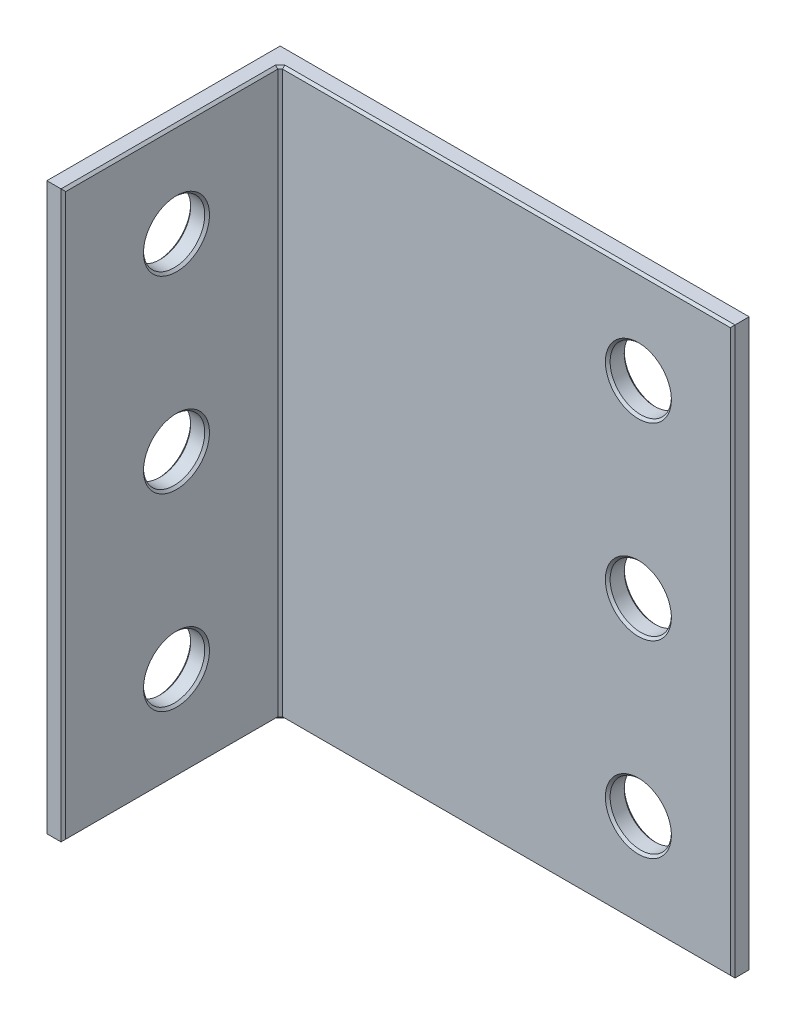
ISO-10303-21;
HEADER;
FILE_DESCRIPTION(('STEP AP214'),'2;1');
FILE_NAME('part.step','',(''),(''),'','','');
FILE_SCHEMA(('AUTOMOTIVE_DESIGN { 1 0 10303 214 1 1 1 1 }'));
ENDSEC;
DATA;
#1=APPLICATION_CONTEXT('core data for automotive mechanical design processes');
#2=APPLICATION_PROTOCOL_DEFINITION('international standard','automotive_design',2000,#1);
#3=PRODUCT_CONTEXT('',#1,'mechanical');
#4=PRODUCT('Part','Part','',(#3));
#5=PRODUCT_RELATED_PRODUCT_CATEGORY('part','',(#4));
#6=PRODUCT_DEFINITION_FORMATION('','',#4);
#7=PRODUCT_DEFINITION_CONTEXT('part definition',#1,'design');
#8=PRODUCT_DEFINITION('design','',#6,#7);
#9=PRODUCT_DEFINITION_SHAPE('','',#8);
#10=(LENGTH_UNIT() NAMED_UNIT(*) SI_UNIT(.MILLI.,.METRE.));
#11=(NAMED_UNIT(*) PLANE_ANGLE_UNIT() SI_UNIT($,.RADIAN.));
#12=(NAMED_UNIT(*) SI_UNIT($,.STERADIAN.) SOLID_ANGLE_UNIT());
#13=UNCERTAINTY_MEASURE_WITH_UNIT(LENGTH_MEASURE(1.E-05),#10,'distance_accuracy_value','');
#14=(GEOMETRIC_REPRESENTATION_CONTEXT(3) GLOBAL_UNCERTAINTY_ASSIGNED_CONTEXT((#13)) GLOBAL_UNIT_ASSIGNED_CONTEXT((#10,
#11,#12)) REPRESENTATION_CONTEXT('',''));
#15=CARTESIAN_POINT('',(0.,0.,0.));
#16=DIRECTION('',(0.,0.,1.));
#17=DIRECTION('',(1.,0.,0.));
#18=AXIS2_PLACEMENT_3D('',#15,#16,#17);
#19=CARTESIAN_POINT('',(0.,0.,8.));
#20=DIRECTION('',(0.,1.,0.));
#21=DIRECTION('',(0.,0.,1.));
#22=AXIS2_PLACEMENT_3D('',#19,#20,#21);
#23=PLANE('',#22);
#24=DIRECTION('',(0.,0.,-1.));
#25=VECTOR('',#24,1.);
#26=CARTESIAN_POINT('',(1.,0.,8.));
#27=LINE('',#26,#25);
#28=CARTESIAN_POINT('',(1.,0.,100.));
#29=VERTEX_POINT('',#28);
#30=CARTESIAN_POINT('',(1.,0.,1.));
#31=VERTEX_POINT('',#30);
#32=EDGE_CURVE('E340',#29,#31,#27,.T.);
#33=ORIENTED_EDGE('',*,*,#32,.T.);
#34=DIRECTION('',(1.,0.,0.));
#35=VECTOR('',#34,1.);
#36=CARTESIAN_POINT('',(200.,0.,1.));
#37=LINE('',#36,#35);
#38=CARTESIAN_POINT('',(200.,0.,1.));
#39=VERTEX_POINT('',#38);
#40=EDGE_CURVE('E342',#31,#39,#37,.T.);
#41=ORIENTED_EDGE('',*,*,#40,.T.);
#42=DIRECTION('',(0.,0.,-1.));
#43=VECTOR('',#42,1.);
#44=CARTESIAN_POINT('',(200.,0.,8.));
#45=LINE('',#44,#43);
#46=CARTESIAN_POINT('',(200.,0.,6.99999999999999));
#47=VERTEX_POINT('',#46);
#48=EDGE_CURVE('E354',#47,#39,#45,.T.);
#49=ORIENTED_EDGE('',*,*,#48,.F.);
#50=DIRECTION('',(-1.,0.,0.));
#51=VECTOR('',#50,1.);
#52=CARTESIAN_POINT('',(0.,0.,6.99999999999999));
#53=LINE('',#52,#51);
#54=CARTESIAN_POINT('',(9.00000000000002,0.,6.99999999999999));
#55=VERTEX_POINT('',#54);
#56=EDGE_CURVE('E336',#47,#55,#53,.T.);
#57=ORIENTED_EDGE('',*,*,#56,.T.);
#58=DIRECTION('',(0.707106781186544,0.,-0.707106781186551));
#59=VECTOR('',#58,1.);
#60=CARTESIAN_POINT('',(9.00000000000002,0.,6.99999999999999));
#61=LINE('',#60,#59);
#62=CARTESIAN_POINT('',(8.00000000000001,0.,8.));
#63=VERTEX_POINT('',#62);
#64=EDGE_CURVE('E332',#63,#55,#61,.T.);
#65=ORIENTED_EDGE('',*,*,#64,.F.);
#66=DIRECTION('',(0.707106781186544,0.,-0.707106781186551));
#67=VECTOR('',#66,1.);
#68=CARTESIAN_POINT('',(9.00000000000002,0.,6.99999999999999));
#69=LINE('',#68,#67);
#70=CARTESIAN_POINT('',(7.00000000000003,0.,9.00000000000001));
#71=VERTEX_POINT('',#70);
#72=EDGE_CURVE('E289',#71,#63,#69,.T.);
#73=ORIENTED_EDGE('',*,*,#72,.F.);
#74=DIRECTION('',(0.,0.,1.));
#75=VECTOR('',#74,1.);
#76=CARTESIAN_POINT('',(7.00000000000003,0.,8.));
#77=LINE('',#76,#75);
#78=CARTESIAN_POINT('',(7.00000000000003,0.,100.));
#79=VERTEX_POINT('',#78);
#80=EDGE_CURVE('E294',#71,#79,#77,.T.);
#81=ORIENTED_EDGE('',*,*,#80,.T.);
#82=DIRECTION('',(1.,0.,0.));
#83=VECTOR('',#82,1.);
#84=CARTESIAN_POINT('',(0.,0.,100.));
#85=LINE('',#84,#83);
#86=EDGE_CURVE('E258',#29,#79,#85,.T.);
#87=ORIENTED_EDGE('',*,*,#86,.F.);
#88=EDGE_LOOP('',(#33,#41,#49,#57,#65,#73,#81,#87));
#89=FACE_BOUND('',#88,.T.);
#90=ADVANCED_FACE('F34',(#89),#23,.F.);
#91=CARTESIAN_POINT('',(0.,240.,8.));
#92=DIRECTION('',(0.,0.,-1.));
#93=DIRECTION('',(-1.,0.,0.));
#94=AXIS2_PLACEMENT_3D('',#91,#92,#93);
#95=PLANE('',#94);
#96=CARTESIAN_POINT('',(160.,120.,8.));
#97=DIRECTION('',(0.,0.,-1.));
#98=DIRECTION('',(-1.,0.,0.));
#99=AXIS2_PLACEMENT_3D('',#96,#97,#98);
#100=CIRCLE('',#99,14.);
#101=CARTESIAN_POINT('',(146.,120.,8.));
#102=VERTEX_POINT('',#101);
#103=EDGE_CURVE('E327',#102,#102,#100,.T.);
#104=ORIENTED_EDGE('',*,*,#103,.T.);
#105=EDGE_LOOP('',(#104));
#106=FACE_BOUND('',#105,.T.);
#107=CARTESIAN_POINT('',(160.,40.,8.));
#108=DIRECTION('',(0.,0.,-1.));
#109=DIRECTION('',(-1.,0.,0.));
#110=AXIS2_PLACEMENT_3D('',#107,#108,#109);
#111=CIRCLE('',#110,14.);
#112=CARTESIAN_POINT('',(146.,40.,8.));
#113=VERTEX_POINT('',#112);
#114=EDGE_CURVE('E320',#113,#113,#111,.T.);
#115=ORIENTED_EDGE('',*,*,#114,.T.);
#116=EDGE_LOOP('',(#115));
#117=FACE_BOUND('',#116,.T.);
#118=CARTESIAN_POINT('',(160.,200.,8.));
#119=DIRECTION('',(0.,0.,-1.));
#120=DIRECTION('',(-1.,0.,0.));
#121=AXIS2_PLACEMENT_3D('',#118,#119,#120);
#122=CIRCLE('',#121,14.);
#123=CARTESIAN_POINT('',(146.,200.,8.));
#124=VERTEX_POINT('',#123);
#125=EDGE_CURVE('E317',#124,#124,#122,.T.);
#126=ORIENTED_EDGE('',*,*,#125,.T.);
#127=EDGE_LOOP('',(#126));
#128=FACE_BOUND('',#127,.T.);
#129=DIRECTION('',(0.,1.,0.));
#130=VECTOR('',#129,1.);
#131=CARTESIAN_POINT('',(199.,240.,8.));
#132=LINE('',#131,#130);
#133=CARTESIAN_POINT('',(199.,1.,8.));
#134=VERTEX_POINT('',#133);
#135=CARTESIAN_POINT('',(199.,239.,8.));
#136=VERTEX_POINT('',#135);
#137=EDGE_CURVE('E314',#134,#136,#132,.T.);
#138=ORIENTED_EDGE('',*,*,#137,.T.);
#139=DIRECTION('',(-1.,0.,0.));
#140=VECTOR('',#139,1.);
#141=CARTESIAN_POINT('',(0.,239.,8.));
#142=LINE('',#141,#140);
#143=CARTESIAN_POINT('',(9.,239.,8.));
#144=VERTEX_POINT('',#143);
#145=EDGE_CURVE('E311',#136,#144,#142,.T.);
#146=ORIENTED_EDGE('',*,*,#145,.T.);
#147=DIRECTION('',(0.,-1.,0.));
#148=VECTOR('',#147,1.);
#149=CARTESIAN_POINT('',(9.00000000000002,0.,8.));
#150=LINE('',#149,#148);
#151=CARTESIAN_POINT('',(9.00000000000002,1.,8.));
#152=VERTEX_POINT('',#151);
#153=EDGE_CURVE('E304',#144,#152,#150,.T.);
#154=ORIENTED_EDGE('',*,*,#153,.T.);
#155=DIRECTION('',(1.,0.,0.));
#156=VECTOR('',#155,1.);
#157=CARTESIAN_POINT('',(0.,1.,8.));
#158=LINE('',#157,#156);
#159=EDGE_CURVE('E307',#152,#134,#158,.T.);
#160=ORIENTED_EDGE('',*,*,#159,.T.);
#161=EDGE_LOOP('',(#138,#146,#154,#160));
#162=FACE_BOUND('',#161,.T.);
#163=ADVANCED_FACE('F312',(#106,#117,#128,#162),#95,.F.);
#164=CARTESIAN_POINT('',(0.,240.,0.));
#165=DIRECTION('',(0.,0.,-1.));
#166=DIRECTION('',(-1.,0.,0.));
#167=AXIS2_PLACEMENT_3D('',#164,#165,#166);
#168=PLANE('',#167);
#169=CARTESIAN_POINT('',(160.,200.,0.));
#170=DIRECTION('',(0.,0.,-1.));
#171=DIRECTION('',(-1.,0.,0.));
#172=AXIS2_PLACEMENT_3D('',#169,#170,#171);
#173=CIRCLE('',#172,14.);
#174=CARTESIAN_POINT('',(146.,200.,0.));
#175=VERTEX_POINT('',#174);
#176=EDGE_CURVE('E386',#175,#175,#173,.F.);
#177=ORIENTED_EDGE('',*,*,#176,.T.);
#178=EDGE_LOOP('',(#177));
#179=FACE_BOUND('',#178,.T.);
#180=CARTESIAN_POINT('',(160.,40.,0.));
#181=DIRECTION('',(0.,0.,-1.));
#182=DIRECTION('',(-1.,0.,0.));
#183=AXIS2_PLACEMENT_3D('',#180,#181,#182);
#184=CIRCLE('',#183,14.);
#185=CARTESIAN_POINT('',(146.,40.,0.));
#186=VERTEX_POINT('',#185);
#187=EDGE_CURVE('E383',#186,#186,#184,.F.);
#188=ORIENTED_EDGE('',*,*,#187,.T.);
#189=EDGE_LOOP('',(#188));
#190=FACE_BOUND('',#189,.T.);
#191=CARTESIAN_POINT('',(160.,120.,0.));
#192=DIRECTION('',(0.,0.,-1.));
#193=DIRECTION('',(-1.,0.,0.));
#194=AXIS2_PLACEMENT_3D('',#191,#192,#193);
#195=CIRCLE('',#194,14.);
#196=CARTESIAN_POINT('',(146.,120.,0.));
#197=VERTEX_POINT('',#196);
#198=EDGE_CURVE('E375',#197,#197,#195,.F.);
#199=ORIENTED_EDGE('',*,*,#198,.T.);
#200=EDGE_LOOP('',(#199));
#201=FACE_BOUND('',#200,.T.);
#202=DIRECTION('',(0.,-1.,0.));
#203=VECTOR('',#202,1.);
#204=CARTESIAN_POINT('',(199.,0.,0.));
#205=LINE('',#204,#203);
#206=CARTESIAN_POINT('',(199.,239.,0.));
#207=VERTEX_POINT('',#206);
#208=CARTESIAN_POINT('',(199.,1.,0.));
#209=VERTEX_POINT('',#208);
#210=EDGE_CURVE('E368',#207,#209,#205,.T.);
#211=ORIENTED_EDGE('',*,*,#210,.T.);
#212=DIRECTION('',(-1.,0.,0.));
#213=VECTOR('',#212,1.);
#214=CARTESIAN_POINT('',(0.,1.,0.));
#215=LINE('',#214,#213);
#216=CARTESIAN_POINT('',(1.,1.,0.));
#217=VERTEX_POINT('',#216);
#218=EDGE_CURVE('E372',#209,#217,#215,.T.);
#219=ORIENTED_EDGE('',*,*,#218,.T.);
#220=DIRECTION('',(0.,1.,0.));
#221=VECTOR('',#220,1.);
#222=CARTESIAN_POINT('',(1.,240.,0.));
#223=LINE('',#222,#221);
#224=CARTESIAN_POINT('',(1.,239.,0.));
#225=VERTEX_POINT('',#224);
#226=EDGE_CURVE('E377',#217,#225,#223,.T.);
#227=ORIENTED_EDGE('',*,*,#226,.T.);
#228=DIRECTION('',(1.,0.,0.));
#229=VECTOR('',#228,1.);
#230=CARTESIAN_POINT('',(200.,239.,0.));
#231=LINE('',#230,#229);
#232=EDGE_CURVE('E373',#225,#207,#231,.T.);
#233=ORIENTED_EDGE('',*,*,#232,.T.);
#234=EDGE_LOOP('',(#211,#219,#227,#233));
#235=FACE_BOUND('',#234,.T.);
#236=ADVANCED_FACE('F432',(#179,#190,#201,#235),#168,.T.);
#237=CARTESIAN_POINT('',(0.,0.,8.));
#238=DIRECTION('',(1.,0.,0.));
#239=DIRECTION('',(0.,0.,-1.));
#240=AXIS2_PLACEMENT_3D('',#237,#238,#239);
#241=PLANE('',#240);
#242=DIRECTION('',(0.,1.,0.));
#243=VECTOR('',#242,1.);
#244=CARTESIAN_POINT('',(0.,240.,99.));
#245=LINE('',#244,#243);
#246=CARTESIAN_POINT('',(0.,1.,99.));
#247=VERTEX_POINT('',#246);
#248=CARTESIAN_POINT('',(0.,239.,99.));
#249=VERTEX_POINT('',#248);
#250=EDGE_CURVE('E190',#247,#249,#245,.T.);
#251=ORIENTED_EDGE('',*,*,#250,.T.);
#252=DIRECTION('',(0.,0.,-1.));
#253=VECTOR('',#252,1.);
#254=CARTESIAN_POINT('',(0.,239.,8.));
#255=LINE('',#254,#253);
#256=CARTESIAN_POINT('',(0.,239.,1.));
#257=VERTEX_POINT('',#256);
#258=EDGE_CURVE('E192',#249,#257,#255,.T.);
#259=ORIENTED_EDGE('',*,*,#258,.T.);
#260=DIRECTION('',(0.,-1.,0.));
#261=VECTOR('',#260,1.);
#262=CARTESIAN_POINT('',(0.,0.,1.));
#263=LINE('',#262,#261);
#264=CARTESIAN_POINT('',(0.,1.,1.));
#265=VERTEX_POINT('',#264);
#266=EDGE_CURVE('E186',#257,#265,#263,.T.);
#267=ORIENTED_EDGE('',*,*,#266,.T.);
#268=DIRECTION('',(0.,0.,1.));
#269=VECTOR('',#268,1.);
#270=CARTESIAN_POINT('',(0.,1.,8.));
#271=LINE('',#270,#269);
#272=EDGE_CURVE('E188',#265,#247,#271,.T.);
#273=ORIENTED_EDGE('',*,*,#272,.T.);
#274=EDGE_LOOP('',(#251,#259,#267,#273));
#275=FACE_BOUND('',#274,.T.);
#276=CARTESIAN_POINT('',(0.,200.,52.));
#277=DIRECTION('',(1.,0.,0.));
#278=DIRECTION('',(0.,0.,-1.));
#279=AXIS2_PLACEMENT_3D('',#276,#277,#278);
#280=CIRCLE('',#279,14.);
#281=CARTESIAN_POINT('',(0.,200.,38.));
#282=VERTEX_POINT('',#281);
#283=EDGE_CURVE('E183',#282,#282,#280,.T.);
#284=ORIENTED_EDGE('',*,*,#283,.T.);
#285=EDGE_LOOP('',(#284));
#286=FACE_BOUND('',#285,.T.);
#287=CARTESIAN_POINT('',(0.,120.,52.));
#288=DIRECTION('',(1.,0.,0.));
#289=DIRECTION('',(0.,0.,-1.));
#290=AXIS2_PLACEMENT_3D('',#287,#288,#289);
#291=CIRCLE('',#290,14.);
#292=CARTESIAN_POINT('',(0.,120.,38.));
#293=VERTEX_POINT('',#292);
#294=EDGE_CURVE('E180',#293,#293,#291,.T.);
#295=ORIENTED_EDGE('',*,*,#294,.T.);
#296=EDGE_LOOP('',(#295));
#297=FACE_BOUND('',#296,.T.);
#298=CARTESIAN_POINT('',(0.,40.,52.));
#299=DIRECTION('',(1.,0.,0.));
#300=DIRECTION('',(0.,0.,-1.));
#301=AXIS2_PLACEMENT_3D('',#298,#299,#300);
#302=CIRCLE('',#301,14.);
#303=CARTESIAN_POINT('',(0.,40.,38.));
#304=VERTEX_POINT('',#303);
#305=EDGE_CURVE('E177',#304,#304,#302,.T.);
#306=ORIENTED_EDGE('',*,*,#305,.T.);
#307=EDGE_LOOP('',(#306));
#308=FACE_BOUND('',#307,.T.);
#309=ADVANCED_FACE('F438',(#275,#286,#297,#308),#241,.F.);
#310=CARTESIAN_POINT('',(200.,0.,8.));
#311=DIRECTION('',(-1.,0.,0.));
#312=DIRECTION('',(0.,0.,1.));
#313=AXIS2_PLACEMENT_3D('',#310,#311,#312);
#314=PLANE('',#313);
#315=ORIENTED_EDGE('',*,*,#48,.T.);
#316=DIRECTION('',(0.,1.,0.));
#317=VECTOR('',#316,1.);
#318=CARTESIAN_POINT('',(200.,240.,1.));
#319=LINE('',#318,#317);
#320=CARTESIAN_POINT('',(200.,240.,1.));
#321=VERTEX_POINT('',#320);
#322=EDGE_CURVE('E158',#39,#321,#319,.T.);
#323=ORIENTED_EDGE('',*,*,#322,.T.);
#324=DIRECTION('',(0.,0.,-1.));
#325=VECTOR('',#324,1.);
#326=CARTESIAN_POINT('',(200.,240.,8.));
#327=LINE('',#326,#325);
#328=CARTESIAN_POINT('',(200.,240.,6.99999999999999));
#329=VERTEX_POINT('',#328);
#330=EDGE_CURVE('E352',#329,#321,#327,.T.);
#331=ORIENTED_EDGE('',*,*,#330,.F.);
#332=DIRECTION('',(0.,-1.,0.));
#333=VECTOR('',#332,1.);
#334=CARTESIAN_POINT('',(200.,0.,6.99999999999999));
#335=LINE('',#334,#333);
#336=EDGE_CURVE('E345',#329,#47,#335,.T.);
#337=ORIENTED_EDGE('',*,*,#336,.T.);
#338=EDGE_LOOP('',(#315,#323,#331,#337));
#339=FACE_BOUND('',#338,.T.);
#340=ADVANCED_FACE('F351',(#339),#314,.F.);
#341=CARTESIAN_POINT('',(0.,240.,8.));
#342=DIRECTION('',(0.,-1.,0.));
#343=DIRECTION('',(0.,0.,-1.));
#344=AXIS2_PLACEMENT_3D('',#341,#342,#343);
#345=PLANE('',#344);
#346=ORIENTED_EDGE('',*,*,#330,.T.);
#347=DIRECTION('',(-1.,0.,0.));
#348=VECTOR('',#347,1.);
#349=CARTESIAN_POINT('',(0.,240.,1.));
#350=LINE('',#349,#348);
#351=CARTESIAN_POINT('',(1.,240.,1.));
#352=VERTEX_POINT('',#351);
#353=EDGE_CURVE('E175',#321,#352,#350,.T.);
#354=ORIENTED_EDGE('',*,*,#353,.T.);
#355=DIRECTION('',(0.,0.,1.));
#356=VECTOR('',#355,1.);
#357=CARTESIAN_POINT('',(1.,240.,8.));
#358=LINE('',#357,#356);
#359=CARTESIAN_POINT('',(1.,240.,100.));
#360=VERTEX_POINT('',#359);
#361=EDGE_CURVE('E173',#352,#360,#358,.T.);
#362=ORIENTED_EDGE('',*,*,#361,.T.);
#363=DIRECTION('',(-1.,0.,0.));
#364=VECTOR('',#363,1.);
#365=CARTESIAN_POINT('',(0.,240.,100.));
#366=LINE('',#365,#364);
#367=CARTESIAN_POINT('',(7.,240.,100.));
#368=VERTEX_POINT('',#367);
#369=EDGE_CURVE('E359',#368,#360,#366,.T.);
#370=ORIENTED_EDGE('',*,*,#369,.F.);
#371=DIRECTION('',(0.,0.,-1.));
#372=VECTOR('',#371,1.);
#373=CARTESIAN_POINT('',(7.,240.,8.));
#374=LINE('',#373,#372);
#375=CARTESIAN_POINT('',(7.,240.,9.00000000000001));
#376=VERTEX_POINT('',#375);
#377=EDGE_CURVE('E154',#368,#376,#374,.T.);
#378=ORIENTED_EDGE('',*,*,#377,.T.);
#379=DIRECTION('',(-0.707106781186544,0.,0.707106781186551));
#380=VECTOR('',#379,1.);
#381=CARTESIAN_POINT('',(7.,240.,9.00000000000001));
#382=LINE('',#381,#380);
#383=CARTESIAN_POINT('',(8.,240.,8.));
#384=VERTEX_POINT('',#383);
#385=EDGE_CURVE('E145',#384,#376,#382,.T.);
#386=ORIENTED_EDGE('',*,*,#385,.F.);
#387=DIRECTION('',(-0.707106781186544,0.,0.707106781186551));
#388=VECTOR('',#387,1.);
#389=CARTESIAN_POINT('',(7.,240.,9.00000000000001));
#390=LINE('',#389,#388);
#391=CARTESIAN_POINT('',(9.,240.,6.99999999999999));
#392=VERTEX_POINT('',#391);
#393=EDGE_CURVE('E150',#392,#384,#390,.T.);
#394=ORIENTED_EDGE('',*,*,#393,.F.);
#395=DIRECTION('',(1.,0.,0.));
#396=VECTOR('',#395,1.);
#397=CARTESIAN_POINT('',(0.,240.,6.99999999999999));
#398=LINE('',#397,#396);
#399=EDGE_CURVE('E165',#392,#329,#398,.T.);
#400=ORIENTED_EDGE('',*,*,#399,.T.);
#401=EDGE_LOOP('',(#346,#354,#362,#370,#378,#386,#394,#400));
#402=FACE_BOUND('',#401,.T.);
#403=ADVANCED_FACE('F148',(#402),#345,.F.);
#404=CARTESIAN_POINT('',(160.,40.,8.));
#405=DIRECTION('',(0.,0.,-1.));
#406=DIRECTION('',(-1.,0.,0.));
#407=AXIS2_PLACEMENT_3D('',#404,#405,#406);
#408=CYLINDRICAL_SURFACE('',#407,13.);
#409=CARTESIAN_POINT('',(160.,40.,1.00000000000001));
#410=DIRECTION('',(0.,0.,-1.));
#411=DIRECTION('',(-1.,0.,0.));
#412=AXIS2_PLACEMENT_3D('',#409,#410,#411);
#413=CIRCLE('',#412,13.);
#414=CARTESIAN_POINT('',(147.,40.,1.00000000000001));
#415=VERTEX_POINT('',#414);
#416=EDGE_CURVE('E398',#415,#415,#413,.T.);
#417=ORIENTED_EDGE('',*,*,#416,.T.);
#418=EDGE_LOOP('',(#417));
#419=FACE_BOUND('',#418,.T.);
#420=CARTESIAN_POINT('',(160.,40.,6.99999999999999));
#421=DIRECTION('',(0.,0.,-1.));
#422=DIRECTION('',(-1.,0.,0.));
#423=AXIS2_PLACEMENT_3D('',#420,#421,#422);
#424=CIRCLE('',#423,13.);
#425=CARTESIAN_POINT('',(147.,40.,6.99999999999999));
#426=VERTEX_POINT('',#425);
#427=EDGE_CURVE('E395',#426,#426,#424,.F.);
#428=ORIENTED_EDGE('',*,*,#427,.T.);
#429=EDGE_LOOP('',(#428));
#430=FACE_BOUND('',#429,.T.);
#431=ADVANCED_FACE('F545',(#419,#430),#408,.F.);
#432=CARTESIAN_POINT('',(160.,120.,8.));
#433=DIRECTION('',(0.,0.,-1.));
#434=DIRECTION('',(-1.,0.,0.));
#435=AXIS2_PLACEMENT_3D('',#432,#433,#434);
#436=CYLINDRICAL_SURFACE('',#435,13.);
#437=CARTESIAN_POINT('',(160.,120.,1.00000000000001));
#438=DIRECTION('',(0.,0.,-1.));
#439=DIRECTION('',(-1.,0.,0.));
#440=AXIS2_PLACEMENT_3D('',#437,#438,#439);
#441=CIRCLE('',#440,13.);
#442=CARTESIAN_POINT('',(147.,120.,1.00000000000001));
#443=VERTEX_POINT('',#442);
#444=EDGE_CURVE('E308',#443,#443,#441,.T.);
#445=ORIENTED_EDGE('',*,*,#444,.T.);
#446=EDGE_LOOP('',(#445));
#447=FACE_BOUND('',#446,.T.);
#448=CARTESIAN_POINT('',(160.,120.,6.99999999999999));
#449=DIRECTION('',(0.,0.,-1.));
#450=DIRECTION('',(-1.,0.,0.));
#451=AXIS2_PLACEMENT_3D('',#448,#449,#450);
#452=CIRCLE('',#451,13.);
#453=CARTESIAN_POINT('',(147.,120.,6.99999999999999));
#454=VERTEX_POINT('',#453);
#455=EDGE_CURVE('E401',#454,#454,#452,.F.);
#456=ORIENTED_EDGE('',*,*,#455,.T.);
#457=EDGE_LOOP('',(#456));
#458=FACE_BOUND('',#457,.T.);
#459=ADVANCED_FACE('F538',(#447,#458),#436,.F.);
#460=CARTESIAN_POINT('',(160.,200.,8.));
#461=DIRECTION('',(0.,0.,-1.));
#462=DIRECTION('',(-1.,0.,0.));
#463=AXIS2_PLACEMENT_3D('',#460,#461,#462);
#464=CYLINDRICAL_SURFACE('',#463,13.);
#465=CARTESIAN_POINT('',(160.,200.,1.));
#466=DIRECTION('',(0.,0.,-1.));
#467=DIRECTION('',(-1.,0.,0.));
#468=AXIS2_PLACEMENT_3D('',#465,#466,#467);
#469=CIRCLE('',#468,13.);
#470=CARTESIAN_POINT('',(147.,200.,1.));
#471=VERTEX_POINT('',#470);
#472=EDGE_CURVE('E392',#471,#471,#469,.T.);
#473=ORIENTED_EDGE('',*,*,#472,.T.);
#474=EDGE_LOOP('',(#473));
#475=FACE_BOUND('',#474,.T.);
#476=CARTESIAN_POINT('',(160.,200.,6.99999999999999));
#477=DIRECTION('',(0.,0.,-1.));
#478=DIRECTION('',(-1.,0.,0.));
#479=AXIS2_PLACEMENT_3D('',#476,#477,#478);
#480=CIRCLE('',#479,13.);
#481=CARTESIAN_POINT('',(147.,200.,6.99999999999999));
#482=VERTEX_POINT('',#481);
#483=EDGE_CURVE('E389',#482,#482,#480,.F.);
#484=ORIENTED_EDGE('',*,*,#483,.T.);
#485=EDGE_LOOP('',(#484));
#486=FACE_BOUND('',#485,.T.);
#487=ADVANCED_FACE('F529',(#475,#486),#464,.F.);
#488=CARTESIAN_POINT('',(8.,240.,100.));
#489=DIRECTION('',(-1.,0.,0.));
#490=DIRECTION('',(0.,-1.,0.));
#491=AXIS2_PLACEMENT_3D('',#488,#489,#490);
#492=PLANE('',#491);
#493=DIRECTION('',(0.,-1.,0.));
#494=VECTOR('',#493,1.);
#495=CARTESIAN_POINT('',(8.00000000000003,0.,99.));
#496=LINE('',#495,#494);
#497=CARTESIAN_POINT('',(8.,239.,99.));
#498=VERTEX_POINT('',#497);
#499=CARTESIAN_POINT('',(8.00000000000003,1.,99.));
#500=VERTEX_POINT('',#499);
#501=EDGE_CURVE('E43',#498,#500,#496,.T.);
#502=ORIENTED_EDGE('',*,*,#501,.T.);
#503=DIRECTION('',(0.,0.,-1.));
#504=VECTOR('',#503,1.);
#505=CARTESIAN_POINT('',(8.00000000000003,1.,100.));
#506=LINE('',#505,#504);
#507=CARTESIAN_POINT('',(8.00000000000003,1.,9.00000000000001));
#508=VERTEX_POINT('',#507);
#509=EDGE_CURVE('E11',#500,#508,#506,.T.);
#510=ORIENTED_EDGE('',*,*,#509,.T.);
#511=DIRECTION('',(0.,1.,0.));
#512=VECTOR('',#511,1.);
#513=CARTESIAN_POINT('',(8.,240.,9.00000000000001));
#514=LINE('',#513,#512);
#515=CARTESIAN_POINT('',(8.,239.,9.00000000000001));
#516=VERTEX_POINT('',#515);
#517=EDGE_CURVE('E226',#508,#516,#514,.T.);
#518=ORIENTED_EDGE('',*,*,#517,.T.);
#519=DIRECTION('',(0.,0.,1.));
#520=VECTOR('',#519,1.);
#521=CARTESIAN_POINT('',(8.,239.,100.));
#522=LINE('',#521,#520);
#523=EDGE_CURVE('E54',#516,#498,#522,.T.);
#524=ORIENTED_EDGE('',*,*,#523,.T.);
#525=EDGE_LOOP('',(#502,#510,#518,#524));
#526=FACE_BOUND('',#525,.T.);
#527=CARTESIAN_POINT('',(8.00000000000001,200.,52.));
#528=DIRECTION('',(-1.,0.,0.));
#529=DIRECTION('',(0.,-1.,0.));
#530=AXIS2_PLACEMENT_3D('',#527,#528,#529);
#531=CIRCLE('',#530,14.);
#532=CARTESIAN_POINT('',(8.00000000000001,186.,52.));
#533=VERTEX_POINT('',#532);
#534=EDGE_CURVE('E223',#533,#533,#531,.T.);
#535=ORIENTED_EDGE('',*,*,#534,.T.);
#536=EDGE_LOOP('',(#535));
#537=FACE_BOUND('',#536,.T.);
#538=CARTESIAN_POINT('',(8.00000000000001,120.,52.));
#539=DIRECTION('',(-1.,0.,0.));
#540=DIRECTION('',(0.,-1.,0.));
#541=AXIS2_PLACEMENT_3D('',#538,#539,#540);
#542=CIRCLE('',#541,14.);
#543=CARTESIAN_POINT('',(8.00000000000002,106.,52.));
#544=VERTEX_POINT('',#543);
#545=EDGE_CURVE('E220',#544,#544,#542,.T.);
#546=ORIENTED_EDGE('',*,*,#545,.T.);
#547=EDGE_LOOP('',(#546));
#548=FACE_BOUND('',#547,.T.);
#549=CARTESIAN_POINT('',(8.00000000000002,40.,52.));
#550=DIRECTION('',(-1.,0.,0.));
#551=DIRECTION('',(0.,-1.,0.));
#552=AXIS2_PLACEMENT_3D('',#549,#550,#551);
#553=CIRCLE('',#552,14.);
#554=CARTESIAN_POINT('',(8.00000000000002,26.,52.));
#555=VERTEX_POINT('',#554);
#556=EDGE_CURVE('E217',#555,#555,#553,.T.);
#557=ORIENTED_EDGE('',*,*,#556,.T.);
#558=EDGE_LOOP('',(#557));
#559=FACE_BOUND('',#558,.T.);
#560=ADVANCED_FACE('F295',(#526,#537,#548,#559),#492,.F.);
#561=CARTESIAN_POINT('',(0.,0.,100.));
#562=DIRECTION('',(0.,0.,1.));
#563=DIRECTION('',(1.,0.,0.));
#564=AXIS2_PLACEMENT_3D('',#561,#562,#563);
#565=PLANE('',#564);
#566=ORIENTED_EDGE('',*,*,#369,.T.);
#567=DIRECTION('',(0.,-1.,0.));
#568=VECTOR('',#567,1.);
#569=CARTESIAN_POINT('',(1.,0.,100.));
#570=LINE('',#569,#568);
#571=EDGE_CURVE('E197',#360,#29,#570,.T.);
#572=ORIENTED_EDGE('',*,*,#571,.T.);
#573=ORIENTED_EDGE('',*,*,#86,.T.);
#574=DIRECTION('',(0.,1.,0.));
#575=VECTOR('',#574,1.);
#576=CARTESIAN_POINT('',(7.,240.,100.));
#577=LINE('',#576,#575);
#578=EDGE_CURVE('E195',#79,#368,#577,.T.);
#579=ORIENTED_EDGE('',*,*,#578,.T.);
#580=EDGE_LOOP('',(#566,#572,#573,#579));
#581=FACE_BOUND('',#580,.T.);
#582=ADVANCED_FACE('F528',(#581),#565,.T.);
#583=CARTESIAN_POINT('',(200.000025,200.,52.));
#584=DIRECTION('',(-1.,0.,0.));
#585=DIRECTION('',(0.,0.,1.));
#586=AXIS2_PLACEMENT_3D('',#583,#584,#585);
#587=CYLINDRICAL_SURFACE('',#586,13.);
#588=CARTESIAN_POINT('',(1.,200.,52.));
#589=DIRECTION('',(1.,0.,0.));
#590=DIRECTION('',(0.,0.,-1.));
#591=AXIS2_PLACEMENT_3D('',#588,#589,#590);
#592=CIRCLE('',#591,13.);
#593=CARTESIAN_POINT('',(1.,200.,39.));
#594=VERTEX_POINT('',#593);
#595=EDGE_CURVE('E202',#594,#594,#592,.F.);
#596=ORIENTED_EDGE('',*,*,#595,.T.);
#597=EDGE_LOOP('',(#596));
#598=FACE_BOUND('',#597,.T.);
#599=CARTESIAN_POINT('',(7.00000000000001,200.,52.));
#600=DIRECTION('',(-1.,0.,0.));
#601=DIRECTION('',(0.,0.,1.));
#602=AXIS2_PLACEMENT_3D('',#599,#600,#601);
#603=CIRCLE('',#602,13.);
#604=CARTESIAN_POINT('',(7.00000000000001,200.,65.));
#605=VERTEX_POINT('',#604);
#606=EDGE_CURVE('E199',#605,#605,#603,.F.);
#607=ORIENTED_EDGE('',*,*,#606,.T.);
#608=EDGE_LOOP('',(#607));
#609=FACE_BOUND('',#608,.T.);
#610=ADVANCED_FACE('F535',(#598,#609),#587,.F.);
#611=CARTESIAN_POINT('',(200.000025,120.,52.));
#612=DIRECTION('',(-1.,0.,0.));
#613=DIRECTION('',(0.,0.,1.));
#614=AXIS2_PLACEMENT_3D('',#611,#612,#613);
#615=CYLINDRICAL_SURFACE('',#614,13.);
#616=CARTESIAN_POINT('',(1.,120.,52.));
#617=DIRECTION('',(1.,0.,0.));
#618=DIRECTION('',(0.,0.,-1.));
#619=AXIS2_PLACEMENT_3D('',#616,#617,#618);
#620=CIRCLE('',#619,13.);
#621=CARTESIAN_POINT('',(1.,120.,39.));
#622=VERTEX_POINT('',#621);
#623=EDGE_CURVE('E208',#622,#622,#620,.F.);
#624=ORIENTED_EDGE('',*,*,#623,.T.);
#625=EDGE_LOOP('',(#624));
#626=FACE_BOUND('',#625,.T.);
#627=CARTESIAN_POINT('',(7.00000000000003,120.,52.));
#628=DIRECTION('',(-1.,0.,0.));
#629=DIRECTION('',(0.,0.,1.));
#630=AXIS2_PLACEMENT_3D('',#627,#628,#629);
#631=CIRCLE('',#630,13.);
#632=CARTESIAN_POINT('',(7.00000000000003,120.,65.));
#633=VERTEX_POINT('',#632);
#634=EDGE_CURVE('E205',#633,#633,#631,.F.);
#635=ORIENTED_EDGE('',*,*,#634,.T.);
#636=EDGE_LOOP('',(#635));
#637=FACE_BOUND('',#636,.T.);
#638=ADVANCED_FACE('F519',(#626,#637),#615,.F.);
#639=CARTESIAN_POINT('',(200.000025,40.,52.));
#640=DIRECTION('',(-1.,0.,0.));
#641=DIRECTION('',(0.,0.,1.));
#642=AXIS2_PLACEMENT_3D('',#639,#640,#641);
#643=CYLINDRICAL_SURFACE('',#642,13.);
#644=CARTESIAN_POINT('',(1.,40.,52.));
#645=DIRECTION('',(1.,0.,0.));
#646=DIRECTION('',(0.,0.,-1.));
#647=AXIS2_PLACEMENT_3D('',#644,#645,#646);
#648=CIRCLE('',#647,13.);
#649=CARTESIAN_POINT('',(1.,40.,39.));
#650=VERTEX_POINT('',#649);
#651=EDGE_CURVE('E214',#650,#650,#648,.F.);
#652=ORIENTED_EDGE('',*,*,#651,.T.);
#653=EDGE_LOOP('',(#652));
#654=FACE_BOUND('',#653,.T.);
#655=CARTESIAN_POINT('',(7.00000000000001,40.,52.));
#656=DIRECTION('',(-1.,0.,0.));
#657=DIRECTION('',(0.,0.,1.));
#658=AXIS2_PLACEMENT_3D('',#655,#656,#657);
#659=CIRCLE('',#658,13.);
#660=CARTESIAN_POINT('',(7.00000000000001,40.,65.));
#661=VERTEX_POINT('',#660);
#662=EDGE_CURVE('E211',#661,#661,#659,.F.);
#663=ORIENTED_EDGE('',*,*,#662,.T.);
#664=EDGE_LOOP('',(#663));
#665=FACE_BOUND('',#664,.T.);
#666=ADVANCED_FACE('F446',(#654,#665),#643,.F.);
#667=CARTESIAN_POINT('',(160.,200.,0.));
#668=DIRECTION('',(0.,0.,-1.));
#669=DIRECTION('',(-1.,0.,0.));
#670=AXIS2_PLACEMENT_3D('',#667,#668,#669);
#671=CONICAL_SURFACE('',#670,14.,0.78539816339745);
#672=ORIENTED_EDGE('',*,*,#472,.F.);
#673=EDGE_LOOP('',(#672));
#674=FACE_BOUND('',#673,.T.);
#675=ORIENTED_EDGE('',*,*,#176,.F.);
#676=EDGE_LOOP('',(#675));
#677=FACE_BOUND('',#676,.T.);
#678=ADVANCED_FACE('F442',(#674,#677),#671,.F.);
#679=CARTESIAN_POINT('',(160.,40.,0.));
#680=DIRECTION('',(0.,0.,-1.));
#681=DIRECTION('',(-1.,0.,0.));
#682=AXIS2_PLACEMENT_3D('',#679,#680,#681);
#683=CONICAL_SURFACE('',#682,14.,0.785398163397448);
#684=ORIENTED_EDGE('',*,*,#416,.F.);
#685=EDGE_LOOP('',(#684));
#686=FACE_BOUND('',#685,.T.);
#687=ORIENTED_EDGE('',*,*,#187,.F.);
#688=EDGE_LOOP('',(#687));
#689=FACE_BOUND('',#688,.T.);
#690=ADVANCED_FACE('F445',(#686,#689),#683,.F.);
#691=CARTESIAN_POINT('',(160.,120.,0.));
#692=DIRECTION('',(0.,0.,-1.));
#693=DIRECTION('',(-1.,0.,0.));
#694=AXIS2_PLACEMENT_3D('',#691,#692,#693);
#695=CONICAL_SURFACE('',#694,14.,0.785398163397448);
#696=ORIENTED_EDGE('',*,*,#444,.F.);
#697=EDGE_LOOP('',(#696));
#698=FACE_BOUND('',#697,.T.);
#699=ORIENTED_EDGE('',*,*,#198,.F.);
#700=EDGE_LOOP('',(#699));
#701=FACE_BOUND('',#700,.T.);
#702=ADVANCED_FACE('F450',(#698,#701),#695,.F.);
#703=CARTESIAN_POINT('',(160.,120.,6.99999999999999));
#704=DIRECTION('',(0.,0.,1.));
#705=DIRECTION('',(1.,0.,0.));
#706=AXIS2_PLACEMENT_3D('',#703,#704,#705);
#707=CONICAL_SURFACE('',#706,13.,0.785398163397447);
#708=ORIENTED_EDGE('',*,*,#103,.F.);
#709=EDGE_LOOP('',(#708));
#710=FACE_BOUND('',#709,.T.);
#711=ORIENTED_EDGE('',*,*,#455,.F.);
#712=EDGE_LOOP('',(#711));
#713=FACE_BOUND('',#712,.T.);
#714=ADVANCED_FACE('F454',(#710,#713),#707,.F.);
#715=CARTESIAN_POINT('',(160.,40.,6.99999999999999));
#716=DIRECTION('',(0.,0.,1.));
#717=DIRECTION('',(1.,0.,0.));
#718=AXIS2_PLACEMENT_3D('',#715,#716,#717);
#719=CONICAL_SURFACE('',#718,13.,0.785398163397447);
#720=ORIENTED_EDGE('',*,*,#114,.F.);
#721=EDGE_LOOP('',(#720));
#722=FACE_BOUND('',#721,.T.);
#723=ORIENTED_EDGE('',*,*,#427,.F.);
#724=EDGE_LOOP('',(#723));
#725=FACE_BOUND('',#724,.T.);
#726=ADVANCED_FACE('F458',(#722,#725),#719,.F.);
#727=CARTESIAN_POINT('',(160.,200.,6.99999999999999));
#728=DIRECTION('',(0.,0.,1.));
#729=DIRECTION('',(1.,0.,0.));
#730=AXIS2_PLACEMENT_3D('',#727,#728,#729);
#731=CONICAL_SURFACE('',#730,13.,0.785398163397447);
#732=ORIENTED_EDGE('',*,*,#125,.F.);
#733=EDGE_LOOP('',(#732));
#734=FACE_BOUND('',#733,.T.);
#735=ORIENTED_EDGE('',*,*,#483,.F.);
#736=EDGE_LOOP('',(#735));
#737=FACE_BOUND('',#736,.T.);
#738=ADVANCED_FACE('F462',(#734,#737),#731,.F.);
#739=CARTESIAN_POINT('',(0.,239.,8.));
#740=DIRECTION('',(0.707106781186547,-0.707106781186549,0.));
#741=DIRECTION('',(0.707106781186549,0.707106781186547,0.));
#742=AXIS2_PLACEMENT_3D('',#739,#740,#741);
#743=PLANE('',#742);
#744=DIRECTION('',(-0.707106781186548,-0.707106781186547,0.));
#745=VECTOR('',#744,1.);
#746=CARTESIAN_POINT('',(1.,240.,1.));
#747=LINE('',#746,#745);
#748=EDGE_CURVE('E252',#257,#352,#747,.F.);
#749=ORIENTED_EDGE('',*,*,#748,.F.);
#750=ORIENTED_EDGE('',*,*,#258,.F.);
#751=DIRECTION('',(0.577350269189627,0.577350269189625,0.577350269189625));
#752=VECTOR('',#751,1.);
#753=CARTESIAN_POINT('',(-79.0000000000001,160.,20.0000000000002));
#754=LINE('',#753,#752);
#755=EDGE_CURVE('E255',#360,#249,#754,.F.);
#756=ORIENTED_EDGE('',*,*,#755,.F.);
#757=ORIENTED_EDGE('',*,*,#361,.F.);
#758=EDGE_LOOP('',(#749,#750,#756,#757));
#759=FACE_BOUND('',#758,.T.);
#760=ADVANCED_FACE('F466',(#759),#743,.F.);
#761=CARTESIAN_POINT('',(1.,0.,100.));
#762=DIRECTION('',(-0.707106781186547,0.,0.707106781186549));
#763=DIRECTION('',(0.707106781186549,0.,0.707106781186547));
#764=AXIS2_PLACEMENT_3D('',#761,#762,#763);
#765=PLANE('',#764);
#766=ORIENTED_EDGE('',*,*,#755,.T.);
#767=ORIENTED_EDGE('',*,*,#250,.F.);
#768=DIRECTION('',(0.577350269189627,-0.577350269189625,0.577350269189625));
#769=VECTOR('',#768,1.);
#770=CARTESIAN_POINT('',(-29.6666666666667,30.6666666666666,69.3333333333334));
#771=LINE('',#770,#769);
#772=EDGE_CURVE('E246',#29,#247,#771,.F.);
#773=ORIENTED_EDGE('',*,*,#772,.F.);
#774=ORIENTED_EDGE('',*,*,#571,.F.);
#775=EDGE_LOOP('',(#766,#767,#773,#774));
#776=FACE_BOUND('',#775,.T.);
#777=ADVANCED_FACE('F492',(#776),#765,.T.);
#778=CARTESIAN_POINT('',(1.,240.,1.));
#779=DIRECTION('',(-0.577350269189625,0.577350269189626,-0.577350269189627));
#780=DIRECTION('',(0.,0.707106781186548,0.707106781186547));
#781=AXIS2_PLACEMENT_3D('',#778,#779,#780);
#782=PLANE('',#781);
#783=DIRECTION('',(0.,-0.707106781186548,-0.707106781186547));
#784=VECTOR('',#783,1.);
#785=CARTESIAN_POINT('',(1.,240.,1.));
#786=LINE('',#785,#784);
#787=EDGE_CURVE('E243',#225,#352,#786,.F.);
#788=ORIENTED_EDGE('',*,*,#787,.F.);
#789=DIRECTION('',(-0.707106781186549,0.,0.707106781186546));
#790=VECTOR('',#789,1.);
#791=CARTESIAN_POINT('',(0.500000000000003,239.,0.499999999999998));
#792=LINE('',#791,#790);
#793=EDGE_CURVE('E249',#257,#225,#792,.F.);
#794=ORIENTED_EDGE('',*,*,#793,.F.);
#795=ORIENTED_EDGE('',*,*,#748,.T.);
#796=EDGE_LOOP('',(#788,#794,#795));
#797=FACE_BOUND('',#796,.T.);
#798=ADVANCED_FACE('F488',(#797),#782,.T.);
#799=CARTESIAN_POINT('',(0.,0.,1.));
#800=DIRECTION('',(-0.707106781186546,0.,-0.707106781186549));
#801=DIRECTION('',(-0.707106781186549,0.,0.707106781186546));
#802=AXIS2_PLACEMENT_3D('',#799,#800,#801);
#803=PLANE('',#802);
#804=ORIENTED_EDGE('',*,*,#793,.T.);
#805=ORIENTED_EDGE('',*,*,#226,.F.);
#806=DIRECTION('',(0.707106781186549,0.,-0.707106781186546));
#807=VECTOR('',#806,1.);
#808=CARTESIAN_POINT('',(1.,1.,0.));
#809=LINE('',#808,#807);
#810=EDGE_CURVE('E240',#265,#217,#809,.T.);
#811=ORIENTED_EDGE('',*,*,#810,.F.);
#812=ORIENTED_EDGE('',*,*,#266,.F.);
#813=EDGE_LOOP('',(#804,#805,#811,#812));
#814=FACE_BOUND('',#813,.T.);
#815=ADVANCED_FACE('F484',(#814),#803,.T.);
#816=CARTESIAN_POINT('',(1.,0.,8.));
#817=DIRECTION('',(0.707106781186546,0.707106781186549,0.));
#818=DIRECTION('',(-0.707106781186549,0.707106781186546,0.));
#819=AXIS2_PLACEMENT_3D('',#816,#817,#818);
#820=PLANE('',#819);
#821=ORIENTED_EDGE('',*,*,#772,.T.);
#822=ORIENTED_EDGE('',*,*,#272,.F.);
#823=DIRECTION('',(0.707106781186549,-0.707106781186546,0.));
#824=VECTOR('',#823,1.);
#825=CARTESIAN_POINT('',(0.500000000000003,0.499999999999999,1.));
#826=LINE('',#825,#824);
#827=EDGE_CURVE('E237',#31,#265,#826,.F.);
#828=ORIENTED_EDGE('',*,*,#827,.F.);
#829=ORIENTED_EDGE('',*,*,#32,.F.);
#830=EDGE_LOOP('',(#821,#822,#828,#829));
#831=FACE_BOUND('',#830,.T.);
#832=ADVANCED_FACE('F481',(#831),#820,.F.);
#833=CARTESIAN_POINT('',(0.,240.,1.));
#834=DIRECTION('',(0.,0.707106781186547,-0.707106781186548));
#835=DIRECTION('',(0.,0.707106781186548,0.707106781186547));
#836=AXIS2_PLACEMENT_3D('',#833,#834,#835);
#837=PLANE('',#836);
#838=ORIENTED_EDGE('',*,*,#787,.T.);
#839=ORIENTED_EDGE('',*,*,#353,.F.);
#840=DIRECTION('',(-0.577350269189626,-0.577350269189626,-0.577350269189626));
#841=VECTOR('',#840,1.);
#842=CARTESIAN_POINT('',(133.333333333333,173.333333333333,-65.6666666666666));
#843=LINE('',#842,#841);
#844=EDGE_CURVE('E234',#207,#321,#843,.F.);
#845=ORIENTED_EDGE('',*,*,#844,.F.);
#846=ORIENTED_EDGE('',*,*,#232,.F.);
#847=EDGE_LOOP('',(#838,#839,#845,#846));
#848=FACE_BOUND('',#847,.T.);
#849=ADVANCED_FACE('F363',(#848),#837,.T.);
#850=CARTESIAN_POINT('',(1.,1.,0.));
#851=DIRECTION('',(-0.577350269189624,-0.577350269189626,-0.577350269189627));
#852=DIRECTION('',(0.,0.707106781186548,-0.707106781186547));
#853=AXIS2_PLACEMENT_3D('',#850,#851,#852);
#854=PLANE('',#853);
#855=ORIENTED_EDGE('',*,*,#827,.T.);
#856=ORIENTED_EDGE('',*,*,#810,.T.);
#857=DIRECTION('',(0.,-0.707106781186548,0.707106781186547));
#858=VECTOR('',#857,1.);
#859=CARTESIAN_POINT('',(1.,1.,0.));
#860=LINE('',#859,#858);
#861=EDGE_CURVE('E232',#31,#217,#860,.F.);
#862=ORIENTED_EDGE('',*,*,#861,.F.);
#863=EDGE_LOOP('',(#855,#856,#862));
#864=FACE_BOUND('',#863,.T.);
#865=ADVANCED_FACE('F475',(#864),#854,.T.);
#866=CARTESIAN_POINT('',(200.,0.,1.));
#867=DIRECTION('',(0.707106781186547,0.,-0.707106781186548));
#868=DIRECTION('',(-0.707106781186548,0.,-0.707106781186547));
#869=AXIS2_PLACEMENT_3D('',#866,#867,#868);
#870=PLANE('',#869);
#871=ORIENTED_EDGE('',*,*,#844,.T.);
#872=ORIENTED_EDGE('',*,*,#322,.F.);
#873=DIRECTION('',(-0.577350269189626,0.577350269189626,-0.577350269189626));
#874=VECTOR('',#873,1.);
#875=CARTESIAN_POINT('',(200.,0.,1.));
#876=LINE('',#875,#874);
#877=EDGE_CURVE('E230',#209,#39,#876,.F.);
#878=ORIENTED_EDGE('',*,*,#877,.F.);
#879=ORIENTED_EDGE('',*,*,#210,.F.);
#880=EDGE_LOOP('',(#871,#872,#878,#879));
#881=FACE_BOUND('',#880,.T.);
#882=ADVANCED_FACE('F367',(#881),#870,.T.);
#883=CARTESIAN_POINT('',(0.,0.,1.));
#884=DIRECTION('',(0.,-0.707106781186547,-0.707106781186548));
#885=DIRECTION('',(0.,0.707106781186548,-0.707106781186547));
#886=AXIS2_PLACEMENT_3D('',#883,#884,#885);
#887=PLANE('',#886);
#888=ORIENTED_EDGE('',*,*,#861,.T.);
#889=ORIENTED_EDGE('',*,*,#218,.F.);
#890=ORIENTED_EDGE('',*,*,#877,.T.);
#891=ORIENTED_EDGE('',*,*,#40,.F.);
#892=EDGE_LOOP('',(#888,#889,#890,#891));
#893=FACE_BOUND('',#892,.T.);
#894=ADVANCED_FACE('F468',(#893),#887,.T.);
#895=CARTESIAN_POINT('',(1.,200.,52.));
#896=DIRECTION('',(-1.,0.,0.));
#897=DIRECTION('',(0.,0.,1.));
#898=AXIS2_PLACEMENT_3D('',#895,#896,#897);
#899=CONICAL_SURFACE('',#898,13.,0.785398163397448);
#900=ORIENTED_EDGE('',*,*,#283,.F.);
#901=EDGE_LOOP('',(#900));
#902=FACE_BOUND('',#901,.T.);
#903=ORIENTED_EDGE('',*,*,#595,.F.);
#904=EDGE_LOOP('',(#903));
#905=FACE_BOUND('',#904,.T.);
#906=ADVANCED_FACE('F471',(#902,#905),#899,.F.);
#907=CARTESIAN_POINT('',(1.,120.,52.));
#908=DIRECTION('',(-1.,0.,0.));
#909=DIRECTION('',(0.,0.,1.));
#910=AXIS2_PLACEMENT_3D('',#907,#908,#909);
#911=CONICAL_SURFACE('',#910,13.,0.785398163397454);
#912=ORIENTED_EDGE('',*,*,#294,.F.);
#913=EDGE_LOOP('',(#912));
#914=FACE_BOUND('',#913,.T.);
#915=ORIENTED_EDGE('',*,*,#623,.F.);
#916=EDGE_LOOP('',(#915));
#917=FACE_BOUND('',#916,.T.);
#918=ADVANCED_FACE('F502',(#914,#917),#911,.F.);
#919=CARTESIAN_POINT('',(1.,40.,52.));
#920=DIRECTION('',(-1.,0.,0.));
#921=DIRECTION('',(0.,0.,1.));
#922=AXIS2_PLACEMENT_3D('',#919,#920,#921);
#923=CONICAL_SURFACE('',#922,13.,0.785398163397454);
#924=ORIENTED_EDGE('',*,*,#305,.F.);
#925=EDGE_LOOP('',(#924));
#926=FACE_BOUND('',#925,.T.);
#927=ORIENTED_EDGE('',*,*,#651,.F.);
#928=EDGE_LOOP('',(#927));
#929=FACE_BOUND('',#928,.T.);
#930=ADVANCED_FACE('F505',(#926,#929),#923,.F.);
#931=CARTESIAN_POINT('',(8.00000000000003,1.,100.));
#932=DIRECTION('',(-0.707106781186549,0.707106781186546,0.));
#933=DIRECTION('',(-0.707106781186546,-0.707106781186549,0.));
#934=AXIS2_PLACEMENT_3D('',#931,#932,#933);
#935=PLANE('',#934);
#936=DIRECTION('',(-0.577350269189624,-0.577350269189627,0.577350269189627));
#937=VECTOR('',#936,1.);
#938=CARTESIAN_POINT('',(7.00000000000003,0.,100.));
#939=LINE('',#938,#937);
#940=EDGE_CURVE('E277',#79,#500,#939,.F.);
#941=ORIENTED_EDGE('',*,*,#940,.F.);
#942=ORIENTED_EDGE('',*,*,#80,.F.);
#943=DIRECTION('',(-0.707106781186546,-0.707106781186549,0.));
#944=VECTOR('',#943,1.);
#945=CARTESIAN_POINT('',(8.00000000000003,1.,9.00000000000001));
#946=LINE('',#945,#944);
#947=EDGE_CURVE('E38',#508,#71,#946,.T.);
#948=ORIENTED_EDGE('',*,*,#947,.F.);
#949=ORIENTED_EDGE('',*,*,#509,.F.);
#950=EDGE_LOOP('',(#941,#942,#948,#949));
#951=FACE_BOUND('',#950,.T.);
#952=ADVANCED_FACE('F293',(#951),#935,.F.);
#953=CARTESIAN_POINT('',(9.00000000000002,1.,8.));
#954=DIRECTION('',(0.577350269189628,-0.577350269189627,0.577350269189623));
#955=DIRECTION('',(0.707106781186546,0.707106781186549,0.));
#956=AXIS2_PLACEMENT_3D('',#953,#954,#955);
#957=PLANE('',#956);
#958=ORIENTED_EDGE('',*,*,#72,.T.);
#959=ORIENTED_EDGE('',*,*,#64,.T.);
#960=DIRECTION('',(0.,0.707106781186545,0.70710678118655));
#961=VECTOR('',#960,1.);
#962=CARTESIAN_POINT('',(9.00000000000002,0.,6.99999999999999));
#963=LINE('',#962,#961);
#964=EDGE_CURVE('E275',#152,#55,#963,.F.);
#965=ORIENTED_EDGE('',*,*,#964,.F.);
#966=DIRECTION('',(0.707106781186544,0.,-0.707106781186551));
#967=VECTOR('',#966,1.);
#968=CARTESIAN_POINT('',(9.00000000000002,1.,8.));
#969=LINE('',#968,#967);
#970=EDGE_CURVE('E272',#508,#152,#969,.T.);
#971=ORIENTED_EDGE('',*,*,#970,.F.);
#972=ORIENTED_EDGE('',*,*,#947,.T.);
#973=EDGE_LOOP('',(#958,#959,#965,#971,#972));
#974=FACE_BOUND('',#973,.T.);
#975=ADVANCED_FACE('F287',(#974),#957,.T.);
#976=CARTESIAN_POINT('',(7.00000000000003,0.,100.));
#977=DIRECTION('',(0.707106781186549,0.,0.707106781186546));
#978=DIRECTION('',(0.707106781186546,0.,-0.707106781186549));
#979=AXIS2_PLACEMENT_3D('',#976,#977,#978);
#980=PLANE('',#979);
#981=ORIENTED_EDGE('',*,*,#940,.T.);
#982=ORIENTED_EDGE('',*,*,#501,.F.);
#983=DIRECTION('',(-0.577350269189624,0.577350269189627,0.577350269189626));
#984=VECTOR('',#983,1.);
#985=CARTESIAN_POINT('',(37.6666666666666,209.333333333333,69.3333333333333));
#986=LINE('',#985,#984);
#987=EDGE_CURVE('E269',#368,#498,#986,.F.);
#988=ORIENTED_EDGE('',*,*,#987,.F.);
#989=ORIENTED_EDGE('',*,*,#578,.F.);
#990=EDGE_LOOP('',(#981,#982,#988,#989));
#991=FACE_BOUND('',#990,.T.);
#992=ADVANCED_FACE('F684',(#991),#980,.T.);
#993=CARTESIAN_POINT('',(0.,1.,8.));
#994=DIRECTION('',(0.,0.70710678118655,-0.707106781186545));
#995=DIRECTION('',(0.,0.707106781186545,0.70710678118655));
#996=AXIS2_PLACEMENT_3D('',#993,#994,#995);
#997=PLANE('',#996);
#998=ORIENTED_EDGE('',*,*,#964,.T.);
#999=ORIENTED_EDGE('',*,*,#56,.F.);
#1000=DIRECTION('',(-0.577350269189624,0.577350269189624,0.577350269189628));
#1001=VECTOR('',#1000,1.);
#1002=CARTESIAN_POINT('',(132.666666666667,67.333333333333,74.3333333333335));
#1003=LINE('',#1002,#1001);
#1004=EDGE_CURVE('E266',#134,#47,#1003,.F.);
#1005=ORIENTED_EDGE('',*,*,#1004,.F.);
#1006=ORIENTED_EDGE('',*,*,#159,.F.);
#1007=EDGE_LOOP('',(#998,#999,#1005,#1006));
#1008=FACE_BOUND('',#1007,.T.);
#1009=ADVANCED_FACE('F409',(#1008),#997,.F.);
#1010=CARTESIAN_POINT('',(8.,240.,9.00000000000001));
#1011=DIRECTION('',(0.707106781186551,0.,0.707106781186544));
#1012=DIRECTION('',(0.707106781186544,0.,-0.707106781186551));
#1013=AXIS2_PLACEMENT_3D('',#1010,#1011,#1012);
#1014=PLANE('',#1013);
#1015=ORIENTED_EDGE('',*,*,#970,.T.);
#1016=ORIENTED_EDGE('',*,*,#153,.F.);
#1017=DIRECTION('',(-0.707106781186544,0.,0.707106781186551));
#1018=VECTOR('',#1017,1.);
#1019=CARTESIAN_POINT('',(8.,239.,9.00000000000001));
#1020=LINE('',#1019,#1018);
#1021=EDGE_CURVE('E264',#516,#144,#1020,.F.);
#1022=ORIENTED_EDGE('',*,*,#1021,.F.);
#1023=ORIENTED_EDGE('',*,*,#517,.F.);
#1024=EDGE_LOOP('',(#1015,#1016,#1022,#1023));
#1025=FACE_BOUND('',#1024,.T.);
#1026=ADVANCED_FACE('F303',(#1025),#1014,.T.);
#1027=CARTESIAN_POINT('',(7.,240.,8.));
#1028=DIRECTION('',(-0.707106781186549,-0.707106781186546,0.));
#1029=DIRECTION('',(0.707106781186546,-0.707106781186549,0.));
#1030=AXIS2_PLACEMENT_3D('',#1027,#1028,#1029);
#1031=PLANE('',#1030);
#1032=ORIENTED_EDGE('',*,*,#987,.T.);
#1033=ORIENTED_EDGE('',*,*,#523,.F.);
#1034=DIRECTION('',(0.707106781186546,-0.707106781186549,0.));
#1035=VECTOR('',#1034,1.);
#1036=CARTESIAN_POINT('',(7.,240.,9.00000000000001));
#1037=LINE('',#1036,#1035);
#1038=EDGE_CURVE('E262',#376,#516,#1037,.T.);
#1039=ORIENTED_EDGE('',*,*,#1038,.F.);
#1040=ORIENTED_EDGE('',*,*,#377,.F.);
#1041=EDGE_LOOP('',(#1032,#1033,#1039,#1040));
#1042=FACE_BOUND('',#1041,.T.);
#1043=ADVANCED_FACE('F300',(#1042),#1031,.F.);
#1044=CARTESIAN_POINT('',(199.,240.,8.));
#1045=DIRECTION('',(-0.70710678118655,0.,-0.707106781186545));
#1046=DIRECTION('',(-0.707106781186545,0.,0.70710678118655));
#1047=AXIS2_PLACEMENT_3D('',#1044,#1045,#1046);
#1048=PLANE('',#1047);
#1049=ORIENTED_EDGE('',*,*,#1004,.T.);
#1050=ORIENTED_EDGE('',*,*,#336,.F.);
#1051=DIRECTION('',(-0.577350269189624,-0.577350269189624,0.577350269189628));
#1052=VECTOR('',#1051,1.);
#1053=CARTESIAN_POINT('',(199.333333333333,239.333333333333,7.66666666666667));
#1054=LINE('',#1053,#1052);
#1055=EDGE_CURVE('E260',#136,#329,#1054,.F.);
#1056=ORIENTED_EDGE('',*,*,#1055,.F.);
#1057=ORIENTED_EDGE('',*,*,#137,.F.);
#1058=EDGE_LOOP('',(#1049,#1050,#1056,#1057));
#1059=FACE_BOUND('',#1058,.T.);
#1060=ADVANCED_FACE('F412',(#1059),#1048,.F.);
#1061=CARTESIAN_POINT('',(8.,239.,9.00000000000001));
#1062=DIRECTION('',(0.577350269189629,0.577350269189626,0.577350269189623));
#1063=DIRECTION('',(-0.707106781186546,0.707106781186549,0.));
#1064=AXIS2_PLACEMENT_3D('',#1061,#1062,#1063);
#1065=PLANE('',#1064);
#1066=ORIENTED_EDGE('',*,*,#1038,.T.);
#1067=ORIENTED_EDGE('',*,*,#1021,.T.);
#1068=DIRECTION('',(0.,0.707106781186545,-0.70710678118655));
#1069=VECTOR('',#1068,1.);
#1070=CARTESIAN_POINT('',(9.,239.,8.));
#1071=LINE('',#1070,#1069);
#1072=EDGE_CURVE('E163',#392,#144,#1071,.F.);
#1073=ORIENTED_EDGE('',*,*,#1072,.F.);
#1074=ORIENTED_EDGE('',*,*,#393,.T.);
#1075=ORIENTED_EDGE('',*,*,#385,.T.);
#1076=EDGE_LOOP('',(#1066,#1067,#1073,#1074,#1075));
#1077=FACE_BOUND('',#1076,.T.);
#1078=ADVANCED_FACE('F161',(#1077),#1065,.T.);
#1079=CARTESIAN_POINT('',(0.,239.,8.));
#1080=DIRECTION('',(0.,-0.70710678118655,-0.707106781186545));
#1081=DIRECTION('',(0.,0.707106781186545,-0.70710678118655));
#1082=AXIS2_PLACEMENT_3D('',#1079,#1080,#1081);
#1083=PLANE('',#1082);
#1084=ORIENTED_EDGE('',*,*,#1055,.T.);
#1085=ORIENTED_EDGE('',*,*,#399,.F.);
#1086=ORIENTED_EDGE('',*,*,#1072,.T.);
#1087=ORIENTED_EDGE('',*,*,#145,.F.);
#1088=EDGE_LOOP('',(#1084,#1085,#1086,#1087));
#1089=FACE_BOUND('',#1088,.T.);
#1090=ADVANCED_FACE('F413',(#1089),#1083,.F.);
#1091=CARTESIAN_POINT('',(8.00000000000001,200.,52.));
#1092=DIRECTION('',(1.,0.,0.));
#1093=DIRECTION('',(0.,0.,-1.));
#1094=AXIS2_PLACEMENT_3D('',#1091,#1092,#1093);
#1095=CONICAL_SURFACE('',#1094,14.,0.785398163397448);
#1096=ORIENTED_EDGE('',*,*,#606,.F.);
#1097=EDGE_LOOP('',(#1096));
#1098=FACE_BOUND('',#1097,.T.);
#1099=ORIENTED_EDGE('',*,*,#534,.F.);
#1100=EDGE_LOOP('',(#1099));
#1101=FACE_BOUND('',#1100,.T.);
#1102=ADVANCED_FACE('F415',(#1098,#1101),#1095,.F.);
#1103=CARTESIAN_POINT('',(8.00000000000004,120.,52.));
#1104=DIRECTION('',(1.,0.,0.));
#1105=DIRECTION('',(0.,0.,-1.));
#1106=AXIS2_PLACEMENT_3D('',#1103,#1104,#1105);
#1107=CONICAL_SURFACE('',#1106,14.,0.785398163397433);
#1108=ORIENTED_EDGE('',*,*,#634,.F.);
#1109=EDGE_LOOP('',(#1108));
#1110=FACE_BOUND('',#1109,.T.);
#1111=ORIENTED_EDGE('',*,*,#545,.F.);
#1112=EDGE_LOOP('',(#1111));
#1113=FACE_BOUND('',#1112,.T.);
#1114=ADVANCED_FACE('F421',(#1110,#1113),#1107,.F.);
#1115=CARTESIAN_POINT('',(8.00000000000004,40.,52.));
#1116=DIRECTION('',(1.,0.,0.));
#1117=DIRECTION('',(0.,0.,-1.));
#1118=AXIS2_PLACEMENT_3D('',#1115,#1116,#1117);
#1119=CONICAL_SURFACE('',#1118,14.,0.785398163397433);
#1120=ORIENTED_EDGE('',*,*,#662,.F.);
#1121=EDGE_LOOP('',(#1120));
#1122=FACE_BOUND('',#1121,.T.);
#1123=ORIENTED_EDGE('',*,*,#556,.F.);
#1124=EDGE_LOOP('',(#1123));
#1125=FACE_BOUND('',#1124,.T.);
#1126=ADVANCED_FACE('F36',(#1122,#1125),#1119,.F.);
#1127=CLOSED_SHELL('',(#90,#163,#236,#309,#340,#403,#431,#459,#487,#560,#582,#610,#638,#666,
#678,#690,#702,#714,#726,#738,#760,#777,#798,#815,#832,#849,#865,#882,#894,#906,#918,#930,#952,
#975,#992,#1009,#1026,#1043,#1060,#1078,#1090,#1102,#1114,#1126));
#1128=MANIFOLD_SOLID_BREP('B2',#1127);
#1129=ADVANCED_BREP_SHAPE_REPRESENTATION('',(#18,#1128),#14);
#1130=SHAPE_DEFINITION_REPRESENTATION(#9,#1129);
ENDSEC;
END-ISO-10303-21;
